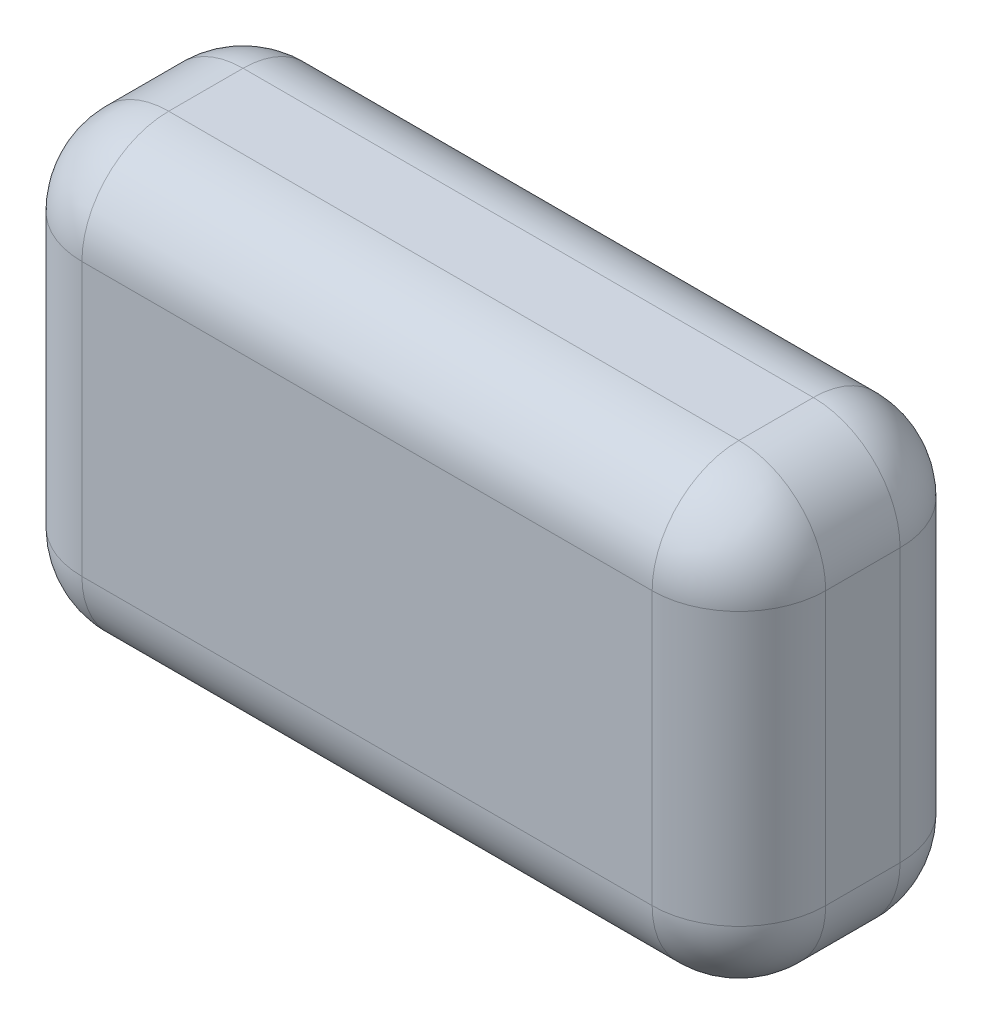
ISO-10303-21;
HEADER;
FILE_DESCRIPTION(('STEP AP214'),'2;1');
FILE_NAME('part.step','',(''),(''),'','','');
FILE_SCHEMA(('AUTOMOTIVE_DESIGN { 1 0 10303 214 1 1 1 1 }'));
ENDSEC;
DATA;
#1=APPLICATION_CONTEXT('core data for automotive mechanical design processes');
#2=APPLICATION_PROTOCOL_DEFINITION('international standard','automotive_design',2000,#1);
#3=PRODUCT_CONTEXT('',#1,'mechanical');
#4=PRODUCT('Part','Part','',(#3));
#5=PRODUCT_RELATED_PRODUCT_CATEGORY('part','',(#4));
#6=PRODUCT_DEFINITION_FORMATION('','',#4);
#7=PRODUCT_DEFINITION_CONTEXT('part definition',#1,'design');
#8=PRODUCT_DEFINITION('design','',#6,#7);
#9=PRODUCT_DEFINITION_SHAPE('','',#8);
#10=(LENGTH_UNIT() NAMED_UNIT(*) SI_UNIT(.MILLI.,.METRE.));
#11=(NAMED_UNIT(*) PLANE_ANGLE_UNIT() SI_UNIT($,.RADIAN.));
#12=(NAMED_UNIT(*) SI_UNIT($,.STERADIAN.) SOLID_ANGLE_UNIT());
#13=UNCERTAINTY_MEASURE_WITH_UNIT(LENGTH_MEASURE(1.E-05),#10,'distance_accuracy_value','');
#14=(GEOMETRIC_REPRESENTATION_CONTEXT(3) GLOBAL_UNCERTAINTY_ASSIGNED_CONTEXT((#13)) GLOBAL_UNIT_ASSIGNED_CONTEXT((#10,
#11,#12)) REPRESENTATION_CONTEXT('',''));
#15=CARTESIAN_POINT('',(0.,0.,0.));
#16=DIRECTION('',(0.,0.,1.));
#17=DIRECTION('',(1.,0.,0.));
#18=AXIS2_PLACEMENT_3D('',#15,#16,#17);
#19=CARTESIAN_POINT('',(381.,228.6,127.));
#20=DIRECTION('',(-1.,0.,0.));
#21=DIRECTION('',(0.,-1.,0.));
#22=AXIS2_PLACEMENT_3D('',#19,#20,#21);
#23=PLANE('',#22);
#24=DIRECTION('',(0.,0.,-1.));
#25=VECTOR('',#24,1.);
#26=CARTESIAN_POINT('',(381.,-139.7,127.));
#27=LINE('',#26,#25);
#28=CARTESIAN_POINT('',(381.,-139.7,38.1));
#29=VERTEX_POINT('',#28);
#30=CARTESIAN_POINT('',(381.,-139.7,-38.1));
#31=VERTEX_POINT('',#30);
#32=EDGE_CURVE('E256',#29,#31,#27,.T.);
#33=ORIENTED_EDGE('',*,*,#32,.T.);
#34=DIRECTION('',(0.,1.,0.));
#35=VECTOR('',#34,1.);
#36=CARTESIAN_POINT('',(381.,228.6,-38.1));
#37=LINE('',#36,#35);
#38=CARTESIAN_POINT('',(381.,139.7,-38.1));
#39=VERTEX_POINT('',#38);
#40=EDGE_CURVE('E251',#31,#39,#37,.T.);
#41=ORIENTED_EDGE('',*,*,#40,.T.);
#42=DIRECTION('',(0.,0.,-1.));
#43=VECTOR('',#42,1.);
#44=CARTESIAN_POINT('',(381.,139.7,127.));
#45=LINE('',#44,#43);
#46=CARTESIAN_POINT('',(381.,139.7,38.1));
#47=VERTEX_POINT('',#46);
#48=EDGE_CURVE('E337',#39,#47,#45,.F.);
#49=ORIENTED_EDGE('',*,*,#48,.T.);
#50=DIRECTION('',(0.,1.,0.));
#51=VECTOR('',#50,1.);
#52=CARTESIAN_POINT('',(381.,-228.6,38.1));
#53=LINE('',#52,#51);
#54=EDGE_CURVE('E246',#47,#29,#53,.F.);
#55=ORIENTED_EDGE('',*,*,#54,.T.);
#56=EDGE_LOOP('',(#33,#41,#49,#55));
#57=FACE_BOUND('',#56,.T.);
#58=ADVANCED_FACE('F45',(#57),#23,.F.);
#59=CARTESIAN_POINT('',(-381.,228.6,127.));
#60=DIRECTION('',(0.,-1.,0.));
#61=DIRECTION('',(0.,0.,-1.));
#62=AXIS2_PLACEMENT_3D('',#59,#60,#61);
#63=PLANE('',#62);
#64=DIRECTION('',(-1.,0.,0.));
#65=VECTOR('',#64,1.);
#66=CARTESIAN_POINT('',(-381.,228.6,-38.1));
#67=LINE('',#66,#65);
#68=CARTESIAN_POINT('',(292.1,228.6,-38.1));
#69=VERTEX_POINT('',#68);
#70=CARTESIAN_POINT('',(-292.1,228.6,-38.1));
#71=VERTEX_POINT('',#70);
#72=EDGE_CURVE('E300',#69,#71,#67,.T.);
#73=ORIENTED_EDGE('',*,*,#72,.T.);
#74=DIRECTION('',(0.,0.,-1.));
#75=VECTOR('',#74,1.);
#76=CARTESIAN_POINT('',(-292.1,228.6,127.));
#77=LINE('',#76,#75);
#78=CARTESIAN_POINT('',(-292.1,228.6,38.1));
#79=VERTEX_POINT('',#78);
#80=EDGE_CURVE('E297',#71,#79,#77,.F.);
#81=ORIENTED_EDGE('',*,*,#80,.T.);
#82=DIRECTION('',(-1.,0.,0.));
#83=VECTOR('',#82,1.);
#84=CARTESIAN_POINT('',(381.,228.6,38.1));
#85=LINE('',#84,#83);
#86=CARTESIAN_POINT('',(292.1,228.6,38.1));
#87=VERTEX_POINT('',#86);
#88=EDGE_CURVE('E288',#79,#87,#85,.F.);
#89=ORIENTED_EDGE('',*,*,#88,.T.);
#90=DIRECTION('',(0.,0.,-1.));
#91=VECTOR('',#90,1.);
#92=CARTESIAN_POINT('',(292.1,228.6,127.));
#93=LINE('',#92,#91);
#94=EDGE_CURVE('E294',#87,#69,#93,.T.);
#95=ORIENTED_EDGE('',*,*,#94,.T.);
#96=EDGE_LOOP('',(#73,#81,#89,#95));
#97=FACE_BOUND('',#96,.T.);
#98=ADVANCED_FACE('F298',(#97),#63,.F.);
#99=CARTESIAN_POINT('',(-381.,228.6,127.));
#100=DIRECTION('',(1.,0.,0.));
#101=DIRECTION('',(0.,1.,0.));
#102=AXIS2_PLACEMENT_3D('',#99,#100,#101);
#103=PLANE('',#102);
#104=DIRECTION('',(0.,-1.,0.));
#105=VECTOR('',#104,1.);
#106=CARTESIAN_POINT('',(-381.,228.6,38.1));
#107=LINE('',#106,#105);
#108=CARTESIAN_POINT('',(-381.,-139.7,38.1));
#109=VERTEX_POINT('',#108);
#110=CARTESIAN_POINT('',(-381.,139.7,38.1));
#111=VERTEX_POINT('',#110);
#112=EDGE_CURVE('E145',#109,#111,#107,.F.);
#113=ORIENTED_EDGE('',*,*,#112,.T.);
#114=DIRECTION('',(0.,0.,-1.));
#115=VECTOR('',#114,1.);
#116=CARTESIAN_POINT('',(-381.,139.7,127.));
#117=LINE('',#116,#115);
#118=CARTESIAN_POINT('',(-381.,139.7,-38.1));
#119=VERTEX_POINT('',#118);
#120=EDGE_CURVE('E140',#111,#119,#117,.T.);
#121=ORIENTED_EDGE('',*,*,#120,.T.);
#122=DIRECTION('',(0.,-1.,0.));
#123=VECTOR('',#122,1.);
#124=CARTESIAN_POINT('',(-381.,228.6,-38.1));
#125=LINE('',#124,#123);
#126=CARTESIAN_POINT('',(-381.,-139.7,-38.1));
#127=VERTEX_POINT('',#126);
#128=EDGE_CURVE('E134',#119,#127,#125,.T.);
#129=ORIENTED_EDGE('',*,*,#128,.T.);
#130=DIRECTION('',(0.,0.,-1.));
#131=VECTOR('',#130,1.);
#132=CARTESIAN_POINT('',(-381.,-139.7,127.));
#133=LINE('',#132,#131);
#134=EDGE_CURVE('E137',#127,#109,#133,.F.);
#135=ORIENTED_EDGE('',*,*,#134,.T.);
#136=EDGE_LOOP('',(#113,#121,#129,#135));
#137=FACE_BOUND('',#136,.T.);
#138=ADVANCED_FACE('F136',(#137),#103,.F.);
#139=CARTESIAN_POINT('',(-381.,-228.6,127.));
#140=DIRECTION('',(0.,1.,0.));
#141=DIRECTION('',(0.,0.,1.));
#142=AXIS2_PLACEMENT_3D('',#139,#140,#141);
#143=PLANE('',#142);
#144=DIRECTION('',(0.,0.,-1.));
#145=VECTOR('',#144,1.);
#146=CARTESIAN_POINT('',(-292.1,-228.6,127.));
#147=LINE('',#146,#145);
#148=CARTESIAN_POINT('',(-292.1,-228.6,38.1));
#149=VERTEX_POINT('',#148);
#150=CARTESIAN_POINT('',(-292.1,-228.6,-38.1));
#151=VERTEX_POINT('',#150);
#152=EDGE_CURVE('E322',#149,#151,#147,.T.);
#153=ORIENTED_EDGE('',*,*,#152,.T.);
#154=DIRECTION('',(1.,0.,0.));
#155=VECTOR('',#154,1.);
#156=CARTESIAN_POINT('',(-381.,-228.6,-38.1));
#157=LINE('',#156,#155);
#158=CARTESIAN_POINT('',(292.1,-228.6,-38.1));
#159=VERTEX_POINT('',#158);
#160=EDGE_CURVE('E331',#151,#159,#157,.T.);
#161=ORIENTED_EDGE('',*,*,#160,.T.);
#162=DIRECTION('',(0.,0.,-1.));
#163=VECTOR('',#162,1.);
#164=CARTESIAN_POINT('',(292.1,-228.6,127.));
#165=LINE('',#164,#163);
#166=CARTESIAN_POINT('',(292.1,-228.6,38.1));
#167=VERTEX_POINT('',#166);
#168=EDGE_CURVE('E328',#159,#167,#165,.F.);
#169=ORIENTED_EDGE('',*,*,#168,.T.);
#170=DIRECTION('',(1.,0.,0.));
#171=VECTOR('',#170,1.);
#172=CARTESIAN_POINT('',(-381.,-228.6,38.1));
#173=LINE('',#172,#171);
#174=EDGE_CURVE('E325',#167,#149,#173,.F.);
#175=ORIENTED_EDGE('',*,*,#174,.T.);
#176=EDGE_LOOP('',(#153,#161,#169,#175));
#177=FACE_BOUND('',#176,.T.);
#178=ADVANCED_FACE('F345',(#177),#143,.F.);
#179=CARTESIAN_POINT('',(0.,0.,127.));
#180=DIRECTION('',(0.,0.,1.));
#181=DIRECTION('',(1.,0.,0.));
#182=AXIS2_PLACEMENT_3D('',#179,#180,#181);
#183=PLANE('',#182);
#184=DIRECTION('',(0.,-1.,0.));
#185=VECTOR('',#184,1.);
#186=CARTESIAN_POINT('',(-292.1,-228.6,127.));
#187=LINE('',#186,#185);
#188=CARTESIAN_POINT('',(-292.1,139.7,127.));
#189=VERTEX_POINT('',#188);
#190=CARTESIAN_POINT('',(-292.1,-139.7,127.));
#191=VERTEX_POINT('',#190);
#192=EDGE_CURVE('E55',#189,#191,#187,.T.);
#193=ORIENTED_EDGE('',*,*,#192,.T.);
#194=DIRECTION('',(1.,0.,0.));
#195=VECTOR('',#194,1.);
#196=CARTESIAN_POINT('',(381.,-139.7,127.));
#197=LINE('',#196,#195);
#198=CARTESIAN_POINT('',(292.1,-139.7,127.));
#199=VERTEX_POINT('',#198);
#200=EDGE_CURVE('E11',#191,#199,#197,.T.);
#201=ORIENTED_EDGE('',*,*,#200,.T.);
#202=DIRECTION('',(0.,1.,0.));
#203=VECTOR('',#202,1.);
#204=CARTESIAN_POINT('',(292.1,228.6,127.));
#205=LINE('',#204,#203);
#206=CARTESIAN_POINT('',(292.1,139.7,127.));
#207=VERTEX_POINT('',#206);
#208=EDGE_CURVE('E248',#199,#207,#205,.T.);
#209=ORIENTED_EDGE('',*,*,#208,.T.);
#210=DIRECTION('',(-1.,0.,0.));
#211=VECTOR('',#210,1.);
#212=CARTESIAN_POINT('',(-381.,139.7,127.));
#213=LINE('',#212,#211);
#214=EDGE_CURVE('E66',#207,#189,#213,.T.);
#215=ORIENTED_EDGE('',*,*,#214,.T.);
#216=EDGE_LOOP('',(#193,#201,#209,#215));
#217=FACE_BOUND('',#216,.T.);
#218=ADVANCED_FACE('F535',(#217),#183,.T.);
#219=CARTESIAN_POINT('',(0.,0.,-127.));
#220=DIRECTION('',(0.,0.,1.));
#221=DIRECTION('',(1.,0.,0.));
#222=AXIS2_PLACEMENT_3D('',#219,#220,#221);
#223=PLANE('',#222);
#224=DIRECTION('',(0.,-1.,0.));
#225=VECTOR('',#224,1.);
#226=CARTESIAN_POINT('',(-292.1,0.,-127.));
#227=LINE('',#226,#225);
#228=CARTESIAN_POINT('',(-292.1,-139.7,-127.));
#229=VERTEX_POINT('',#228);
#230=CARTESIAN_POINT('',(-292.1,139.7,-127.));
#231=VERTEX_POINT('',#230);
#232=EDGE_CURVE('E169',#229,#231,#227,.F.);
#233=ORIENTED_EDGE('',*,*,#232,.T.);
#234=DIRECTION('',(-1.,0.,0.));
#235=VECTOR('',#234,1.);
#236=CARTESIAN_POINT('',(0.,139.7,-127.));
#237=LINE('',#236,#235);
#238=CARTESIAN_POINT('',(292.1,139.7,-127.));
#239=VERTEX_POINT('',#238);
#240=EDGE_CURVE('E318',#231,#239,#237,.F.);
#241=ORIENTED_EDGE('',*,*,#240,.T.);
#242=DIRECTION('',(0.,1.,0.));
#243=VECTOR('',#242,1.);
#244=CARTESIAN_POINT('',(292.1,0.,-127.));
#245=LINE('',#244,#243);
#246=CARTESIAN_POINT('',(292.1,-139.7,-127.));
#247=VERTEX_POINT('',#246);
#248=EDGE_CURVE('E305',#239,#247,#245,.F.);
#249=ORIENTED_EDGE('',*,*,#248,.T.);
#250=DIRECTION('',(1.,0.,0.));
#251=VECTOR('',#250,1.);
#252=CARTESIAN_POINT('',(0.,-139.7,-127.));
#253=LINE('',#252,#251);
#254=EDGE_CURVE('E309',#247,#229,#253,.F.);
#255=ORIENTED_EDGE('',*,*,#254,.T.);
#256=EDGE_LOOP('',(#233,#241,#249,#255));
#257=FACE_BOUND('',#256,.T.);
#258=ADVANCED_FACE('F528',(#257),#223,.F.);
#259=CARTESIAN_POINT('',(292.1,-139.7,127.));
#260=DIRECTION('',(0.,0.,-1.));
#261=DIRECTION('',(-1.,0.,0.));
#262=AXIS2_PLACEMENT_3D('',#259,#260,#261);
#263=CYLINDRICAL_SURFACE('',#262,88.9);
#264=CARTESIAN_POINT('',(292.1,-139.7,38.1));
#265=DIRECTION('',(0.,0.,1.));
#266=DIRECTION('',(1.,0.,0.));
#267=AXIS2_PLACEMENT_3D('',#264,#265,#266);
#268=CIRCLE('',#267,88.9);
#269=EDGE_CURVE('E49',#167,#29,#268,.T.);
#270=ORIENTED_EDGE('',*,*,#269,.F.);
#271=ORIENTED_EDGE('',*,*,#168,.F.);
#272=CARTESIAN_POINT('',(292.1,-139.7,-38.1));
#273=DIRECTION('',(0.,0.,-1.));
#274=DIRECTION('',(-1.,0.,0.));
#275=AXIS2_PLACEMENT_3D('',#272,#273,#274);
#276=CIRCLE('',#275,88.9);
#277=EDGE_CURVE('E224',#31,#159,#276,.T.);
#278=ORIENTED_EDGE('',*,*,#277,.F.);
#279=ORIENTED_EDGE('',*,*,#32,.F.);
#280=EDGE_LOOP('',(#270,#271,#278,#279));
#281=FACE_BOUND('',#280,.T.);
#282=ADVANCED_FACE('F47',(#281),#263,.T.);
#283=CARTESIAN_POINT('',(292.1,-139.7,38.1));
#284=DIRECTION('',(1.,0.,0.));
#285=DIRECTION('',(0.,1.,0.));
#286=AXIS2_PLACEMENT_3D('',#283,#284,#285);
#287=SPHERICAL_SURFACE('',#286,88.9);
#288=CARTESIAN_POINT('',(292.1,-139.7,38.1));
#289=DIRECTION('',(1.,0.,0.));
#290=DIRECTION('',(0.,0.,-1.));
#291=AXIS2_PLACEMENT_3D('',#288,#289,#290);
#292=CIRCLE('',#291,88.9);
#293=EDGE_CURVE('E217',#167,#199,#292,.F.);
#294=ORIENTED_EDGE('',*,*,#293,.F.);
#295=ORIENTED_EDGE('',*,*,#269,.T.);
#296=CARTESIAN_POINT('',(292.1,-139.7,38.1));
#297=DIRECTION('',(0.,-1.,0.));
#298=DIRECTION('',(1.,0.,0.));
#299=AXIS2_PLACEMENT_3D('',#296,#297,#298);
#300=CIRCLE('',#299,88.9);
#301=EDGE_CURVE('E221',#199,#29,#300,.F.);
#302=ORIENTED_EDGE('',*,*,#301,.F.);
#303=EDGE_LOOP('',(#294,#295,#302));
#304=FACE_BOUND('',#303,.T.);
#305=ADVANCED_FACE('F238',(#304),#287,.T.);
#306=CARTESIAN_POINT('',(292.1,-139.7,-38.1));
#307=DIRECTION('',(0.,-1.,0.));
#308=DIRECTION('',(0.,0.,-1.));
#309=AXIS2_PLACEMENT_3D('',#306,#307,#308);
#310=SPHERICAL_SURFACE('',#309,88.9);
#311=CARTESIAN_POINT('',(292.1,-139.7,-38.1));
#312=DIRECTION('',(0.,-1.,0.));
#313=DIRECTION('',(1.,0.,0.));
#314=AXIS2_PLACEMENT_3D('',#311,#312,#313);
#315=CIRCLE('',#314,88.9);
#316=EDGE_CURVE('E210',#31,#247,#315,.F.);
#317=ORIENTED_EDGE('',*,*,#316,.F.);
#318=ORIENTED_EDGE('',*,*,#277,.T.);
#319=CARTESIAN_POINT('',(292.1,-139.7,-38.1));
#320=DIRECTION('',(1.,0.,0.));
#321=DIRECTION('',(0.,0.,-1.));
#322=AXIS2_PLACEMENT_3D('',#319,#320,#321);
#323=CIRCLE('',#322,88.9);
#324=EDGE_CURVE('E214',#247,#159,#323,.F.);
#325=ORIENTED_EDGE('',*,*,#324,.F.);
#326=EDGE_LOOP('',(#317,#318,#325));
#327=FACE_BOUND('',#326,.T.);
#328=ADVANCED_FACE('F349',(#327),#310,.T.);
#329=CARTESIAN_POINT('',(292.1,0.,38.1));
#330=DIRECTION('',(0.,-1.,0.));
#331=DIRECTION('',(1.,0.,0.));
#332=AXIS2_PLACEMENT_3D('',#329,#330,#331);
#333=CYLINDRICAL_SURFACE('',#332,88.9);
#334=ORIENTED_EDGE('',*,*,#301,.T.);
#335=ORIENTED_EDGE('',*,*,#54,.F.);
#336=CARTESIAN_POINT('',(292.1,139.7,38.1));
#337=DIRECTION('',(0.,1.,0.));
#338=DIRECTION('',(-1.,0.,0.));
#339=AXIS2_PLACEMENT_3D('',#336,#337,#338);
#340=CIRCLE('',#339,88.9);
#341=EDGE_CURVE('E202',#207,#47,#340,.T.);
#342=ORIENTED_EDGE('',*,*,#341,.F.);
#343=ORIENTED_EDGE('',*,*,#208,.F.);
#344=EDGE_LOOP('',(#334,#335,#342,#343));
#345=FACE_BOUND('',#344,.T.);
#346=ADVANCED_FACE('F244',(#345),#333,.T.);
#347=CARTESIAN_POINT('',(0.,-139.7,38.1));
#348=DIRECTION('',(-1.,0.,0.));
#349=DIRECTION('',(0.,0.,1.));
#350=AXIS2_PLACEMENT_3D('',#347,#348,#349);
#351=CYLINDRICAL_SURFACE('',#350,88.9);
#352=ORIENTED_EDGE('',*,*,#293,.T.);
#353=ORIENTED_EDGE('',*,*,#200,.F.);
#354=CARTESIAN_POINT('',(-292.1,-139.7,38.1));
#355=DIRECTION('',(-1.,0.,0.));
#356=DIRECTION('',(0.,0.,1.));
#357=AXIS2_PLACEMENT_3D('',#354,#355,#356);
#358=CIRCLE('',#357,88.9);
#359=EDGE_CURVE('E198',#149,#191,#358,.T.);
#360=ORIENTED_EDGE('',*,*,#359,.F.);
#361=ORIENTED_EDGE('',*,*,#174,.F.);
#362=EDGE_LOOP('',(#352,#353,#360,#361));
#363=FACE_BOUND('',#362,.T.);
#364=ADVANCED_FACE('F492',(#363),#351,.T.);
#365=CARTESIAN_POINT('',(-292.1,-139.7,127.));
#366=DIRECTION('',(0.,0.,-1.));
#367=DIRECTION('',(-1.,0.,0.));
#368=AXIS2_PLACEMENT_3D('',#365,#366,#367);
#369=CYLINDRICAL_SURFACE('',#368,88.9);
#370=CARTESIAN_POINT('',(-292.1,-139.7,-38.1));
#371=DIRECTION('',(0.,0.,-1.));
#372=DIRECTION('',(-1.,0.,0.));
#373=AXIS2_PLACEMENT_3D('',#370,#371,#372);
#374=CIRCLE('',#373,88.9);
#375=EDGE_CURVE('E152',#151,#127,#374,.T.);
#376=ORIENTED_EDGE('',*,*,#375,.F.);
#377=ORIENTED_EDGE('',*,*,#152,.F.);
#378=CARTESIAN_POINT('',(-292.1,-139.7,38.1));
#379=DIRECTION('',(0.,0.,1.));
#380=DIRECTION('',(1.,0.,0.));
#381=AXIS2_PLACEMENT_3D('',#378,#379,#380);
#382=CIRCLE('',#381,88.9);
#383=EDGE_CURVE('E155',#109,#149,#382,.T.);
#384=ORIENTED_EDGE('',*,*,#383,.F.);
#385=ORIENTED_EDGE('',*,*,#134,.F.);
#386=EDGE_LOOP('',(#376,#377,#384,#385));
#387=FACE_BOUND('',#386,.T.);
#388=ADVANCED_FACE('F150',(#387),#369,.T.);
#389=CARTESIAN_POINT('',(-381.,-139.7,-38.1));
#390=DIRECTION('',(1.,0.,0.));
#391=DIRECTION('',(0.,0.,-1.));
#392=AXIS2_PLACEMENT_3D('',#389,#390,#391);
#393=CYLINDRICAL_SURFACE('',#392,88.9);
#394=ORIENTED_EDGE('',*,*,#324,.T.);
#395=ORIENTED_EDGE('',*,*,#160,.F.);
#396=CARTESIAN_POINT('',(-292.1,-139.7,-38.1));
#397=DIRECTION('',(-1.,0.,0.));
#398=DIRECTION('',(0.,-1.,0.));
#399=AXIS2_PLACEMENT_3D('',#396,#397,#398);
#400=CIRCLE('',#399,88.9);
#401=EDGE_CURVE('E165',#229,#151,#400,.T.);
#402=ORIENTED_EDGE('',*,*,#401,.F.);
#403=ORIENTED_EDGE('',*,*,#254,.F.);
#404=EDGE_LOOP('',(#394,#395,#402,#403));
#405=FACE_BOUND('',#404,.T.);
#406=ADVANCED_FACE('F347',(#405),#393,.T.);
#407=CARTESIAN_POINT('',(292.1,228.6,-38.1));
#408=DIRECTION('',(0.,1.,0.));
#409=DIRECTION('',(-1.,0.,0.));
#410=AXIS2_PLACEMENT_3D('',#407,#408,#409);
#411=CYLINDRICAL_SURFACE('',#410,88.9);
#412=ORIENTED_EDGE('',*,*,#316,.T.);
#413=ORIENTED_EDGE('',*,*,#248,.F.);
#414=CARTESIAN_POINT('',(292.1,139.7,-38.1));
#415=DIRECTION('',(0.,1.,0.));
#416=DIRECTION('',(-1.,0.,0.));
#417=AXIS2_PLACEMENT_3D('',#414,#415,#416);
#418=CIRCLE('',#417,88.9);
#419=EDGE_CURVE('E190',#39,#239,#418,.T.);
#420=ORIENTED_EDGE('',*,*,#419,.F.);
#421=ORIENTED_EDGE('',*,*,#40,.F.);
#422=EDGE_LOOP('',(#412,#413,#420,#421));
#423=FACE_BOUND('',#422,.T.);
#424=ADVANCED_FACE('F352',(#423),#411,.T.);
#425=CARTESIAN_POINT('',(292.1,139.7,127.));
#426=DIRECTION('',(0.,0.,-1.));
#427=DIRECTION('',(-1.,0.,0.));
#428=AXIS2_PLACEMENT_3D('',#425,#426,#427);
#429=CYLINDRICAL_SURFACE('',#428,88.9);
#430=CARTESIAN_POINT('',(292.1,139.7,38.1));
#431=DIRECTION('',(0.,0.,1.));
#432=DIRECTION('',(1.,0.,0.));
#433=AXIS2_PLACEMENT_3D('',#430,#431,#432);
#434=CIRCLE('',#433,88.9);
#435=EDGE_CURVE('E206',#47,#87,#434,.T.);
#436=ORIENTED_EDGE('',*,*,#435,.F.);
#437=ORIENTED_EDGE('',*,*,#48,.F.);
#438=CARTESIAN_POINT('',(292.1,139.7,-38.1));
#439=DIRECTION('',(0.,0.,-1.));
#440=DIRECTION('',(-1.,0.,0.));
#441=AXIS2_PLACEMENT_3D('',#438,#439,#440);
#442=CIRCLE('',#441,88.9);
#443=EDGE_CURVE('E186',#69,#39,#442,.T.);
#444=ORIENTED_EDGE('',*,*,#443,.F.);
#445=ORIENTED_EDGE('',*,*,#94,.F.);
#446=EDGE_LOOP('',(#436,#437,#444,#445));
#447=FACE_BOUND('',#446,.T.);
#448=ADVANCED_FACE('F359',(#447),#429,.T.);
#449=CARTESIAN_POINT('',(292.1,139.7,38.1));
#450=DIRECTION('',(1.,0.,0.));
#451=DIRECTION('',(0.,1.,0.));
#452=AXIS2_PLACEMENT_3D('',#449,#450,#451);
#453=SPHERICAL_SURFACE('',#452,88.9);
#454=ORIENTED_EDGE('',*,*,#341,.T.);
#455=ORIENTED_EDGE('',*,*,#435,.T.);
#456=CARTESIAN_POINT('',(292.1,139.7,38.1));
#457=DIRECTION('',(1.,0.,0.));
#458=DIRECTION('',(0.,0.,-1.));
#459=AXIS2_PLACEMENT_3D('',#456,#457,#458);
#460=CIRCLE('',#459,88.9);
#461=EDGE_CURVE('E177',#207,#87,#460,.F.);
#462=ORIENTED_EDGE('',*,*,#461,.F.);
#463=EDGE_LOOP('',(#454,#455,#462));
#464=FACE_BOUND('',#463,.T.);
#465=ADVANCED_FACE('F361',(#464),#453,.T.);
#466=CARTESIAN_POINT('',(-292.1,-139.7,38.1));
#467=DIRECTION('',(0.,-1.,0.));
#468=DIRECTION('',(1.,0.,0.));
#469=AXIS2_PLACEMENT_3D('',#466,#467,#468);
#470=SPHERICAL_SURFACE('',#469,88.9);
#471=ORIENTED_EDGE('',*,*,#383,.T.);
#472=ORIENTED_EDGE('',*,*,#359,.T.);
#473=CARTESIAN_POINT('',(-292.1,-139.7,38.1));
#474=DIRECTION('',(0.,-1.,0.));
#475=DIRECTION('',(1.,0.,0.));
#476=AXIS2_PLACEMENT_3D('',#473,#474,#475);
#477=CIRCLE('',#476,88.9);
#478=EDGE_CURVE('E171',#109,#191,#477,.F.);
#479=ORIENTED_EDGE('',*,*,#478,.F.);
#480=EDGE_LOOP('',(#471,#472,#479));
#481=FACE_BOUND('',#480,.T.);
#482=ADVANCED_FACE('F363',(#481),#470,.T.);
#483=CARTESIAN_POINT('',(-292.1,-139.7,-38.1));
#484=DIRECTION('',(0.,-1.,0.));
#485=DIRECTION('',(1.,0.,0.));
#486=AXIS2_PLACEMENT_3D('',#483,#484,#485);
#487=SPHERICAL_SURFACE('',#486,88.9);
#488=ORIENTED_EDGE('',*,*,#401,.T.);
#489=ORIENTED_EDGE('',*,*,#375,.T.);
#490=CARTESIAN_POINT('',(-292.1,-139.7,-38.1));
#491=DIRECTION('',(0.,-1.,0.));
#492=DIRECTION('',(1.,0.,0.));
#493=AXIS2_PLACEMENT_3D('',#490,#491,#492);
#494=CIRCLE('',#493,88.9);
#495=EDGE_CURVE('E162',#229,#127,#494,.F.);
#496=ORIENTED_EDGE('',*,*,#495,.F.);
#497=EDGE_LOOP('',(#488,#489,#496));
#498=FACE_BOUND('',#497,.T.);
#499=ADVANCED_FACE('F161',(#498),#487,.T.);
#500=CARTESIAN_POINT('',(292.1,139.7,-38.1));
#501=DIRECTION('',(1.,0.,0.));
#502=DIRECTION('',(0.,1.,0.));
#503=AXIS2_PLACEMENT_3D('',#500,#501,#502);
#504=SPHERICAL_SURFACE('',#503,88.9);
#505=ORIENTED_EDGE('',*,*,#443,.T.);
#506=ORIENTED_EDGE('',*,*,#419,.T.);
#507=CARTESIAN_POINT('',(292.1,139.7,-38.1));
#508=DIRECTION('',(1.,0.,0.));
#509=DIRECTION('',(0.,0.,-1.));
#510=AXIS2_PLACEMENT_3D('',#507,#508,#509);
#511=CIRCLE('',#510,88.9);
#512=EDGE_CURVE('E172',#69,#239,#511,.F.);
#513=ORIENTED_EDGE('',*,*,#512,.F.);
#514=EDGE_LOOP('',(#505,#506,#513));
#515=FACE_BOUND('',#514,.T.);
#516=ADVANCED_FACE('F357',(#515),#504,.T.);
#517=CARTESIAN_POINT('',(0.,139.7,38.1));
#518=DIRECTION('',(1.,0.,0.));
#519=DIRECTION('',(0.,0.,-1.));
#520=AXIS2_PLACEMENT_3D('',#517,#518,#519);
#521=CYLINDRICAL_SURFACE('',#520,88.9);
#522=ORIENTED_EDGE('',*,*,#461,.T.);
#523=ORIENTED_EDGE('',*,*,#88,.F.);
#524=CARTESIAN_POINT('',(-292.1,139.7,38.1));
#525=DIRECTION('',(-1.,0.,0.));
#526=DIRECTION('',(0.,0.,1.));
#527=AXIS2_PLACEMENT_3D('',#524,#525,#526);
#528=CIRCLE('',#527,88.9);
#529=EDGE_CURVE('E179',#189,#79,#528,.T.);
#530=ORIENTED_EDGE('',*,*,#529,.F.);
#531=ORIENTED_EDGE('',*,*,#214,.F.);
#532=EDGE_LOOP('',(#522,#523,#530,#531));
#533=FACE_BOUND('',#532,.T.);
#534=ADVANCED_FACE('F290',(#533),#521,.T.);
#535=CARTESIAN_POINT('',(-292.1,0.,38.1));
#536=DIRECTION('',(0.,1.,0.));
#537=DIRECTION('',(-1.,0.,0.));
#538=AXIS2_PLACEMENT_3D('',#535,#536,#537);
#539=CYLINDRICAL_SURFACE('',#538,88.9);
#540=ORIENTED_EDGE('',*,*,#478,.T.);
#541=ORIENTED_EDGE('',*,*,#192,.F.);
#542=CARTESIAN_POINT('',(-292.1,139.7,38.1));
#543=DIRECTION('',(0.,1.,0.));
#544=DIRECTION('',(-1.,0.,0.));
#545=AXIS2_PLACEMENT_3D('',#542,#543,#544);
#546=CIRCLE('',#545,88.9);
#547=EDGE_CURVE('E276',#111,#189,#546,.T.);
#548=ORIENTED_EDGE('',*,*,#547,.F.);
#549=ORIENTED_EDGE('',*,*,#112,.F.);
#550=EDGE_LOOP('',(#540,#541,#548,#549));
#551=FACE_BOUND('',#550,.T.);
#552=ADVANCED_FACE('F395',(#551),#539,.T.);
#553=CARTESIAN_POINT('',(-292.1,228.6,-38.1));
#554=DIRECTION('',(0.,-1.,0.));
#555=DIRECTION('',(1.,0.,0.));
#556=AXIS2_PLACEMENT_3D('',#553,#554,#555);
#557=CYLINDRICAL_SURFACE('',#556,88.9);
#558=ORIENTED_EDGE('',*,*,#495,.T.);
#559=ORIENTED_EDGE('',*,*,#128,.F.);
#560=CARTESIAN_POINT('',(-292.1,139.7,-38.1));
#561=DIRECTION('',(0.,1.,0.));
#562=DIRECTION('',(-1.,0.,0.));
#563=AXIS2_PLACEMENT_3D('',#560,#561,#562);
#564=CIRCLE('',#563,88.9);
#565=EDGE_CURVE('E272',#231,#119,#564,.T.);
#566=ORIENTED_EDGE('',*,*,#565,.F.);
#567=ORIENTED_EDGE('',*,*,#232,.F.);
#568=EDGE_LOOP('',(#558,#559,#566,#567));
#569=FACE_BOUND('',#568,.T.);
#570=ADVANCED_FACE('F168',(#569),#557,.T.);
#571=CARTESIAN_POINT('',(-381.,139.7,-38.1));
#572=DIRECTION('',(-1.,0.,0.));
#573=DIRECTION('',(0.,0.,1.));
#574=AXIS2_PLACEMENT_3D('',#571,#572,#573);
#575=CYLINDRICAL_SURFACE('',#574,88.9);
#576=ORIENTED_EDGE('',*,*,#512,.T.);
#577=ORIENTED_EDGE('',*,*,#240,.F.);
#578=CARTESIAN_POINT('',(-292.1,139.7,-38.1));
#579=DIRECTION('',(-1.,0.,0.));
#580=DIRECTION('',(0.,0.,1.));
#581=AXIS2_PLACEMENT_3D('',#578,#579,#580);
#582=CIRCLE('',#581,88.9);
#583=EDGE_CURVE('E268',#71,#231,#582,.T.);
#584=ORIENTED_EDGE('',*,*,#583,.F.);
#585=ORIENTED_EDGE('',*,*,#72,.F.);
#586=EDGE_LOOP('',(#576,#577,#584,#585));
#587=FACE_BOUND('',#586,.T.);
#588=ADVANCED_FACE('F389',(#587),#575,.T.);
#589=CARTESIAN_POINT('',(-292.1,139.7,38.1));
#590=DIRECTION('',(0.,0.,1.));
#591=DIRECTION('',(1.,0.,0.));
#592=AXIS2_PLACEMENT_3D('',#589,#590,#591);
#593=SPHERICAL_SURFACE('',#592,88.9);
#594=ORIENTED_EDGE('',*,*,#547,.T.);
#595=ORIENTED_EDGE('',*,*,#529,.T.);
#596=CARTESIAN_POINT('',(-292.1,139.7,38.1));
#597=DIRECTION('',(0.,0.,1.));
#598=DIRECTION('',(1.,0.,0.));
#599=AXIS2_PLACEMENT_3D('',#596,#597,#598);
#600=CIRCLE('',#599,88.9);
#601=EDGE_CURVE('E265',#111,#79,#600,.F.);
#602=ORIENTED_EDGE('',*,*,#601,.F.);
#603=EDGE_LOOP('',(#594,#595,#602));
#604=FACE_BOUND('',#603,.T.);
#605=ADVANCED_FACE('F285',(#604),#593,.T.);
#606=CARTESIAN_POINT('',(-292.1,139.7,-38.1));
#607=DIRECTION('',(0.,0.,-1.));
#608=DIRECTION('',(-1.,0.,0.));
#609=AXIS2_PLACEMENT_3D('',#606,#607,#608);
#610=SPHERICAL_SURFACE('',#609,88.9);
#611=ORIENTED_EDGE('',*,*,#583,.T.);
#612=ORIENTED_EDGE('',*,*,#565,.T.);
#613=CARTESIAN_POINT('',(-292.1,139.7,-38.1));
#614=DIRECTION('',(0.,0.,-1.));
#615=DIRECTION('',(-1.,0.,0.));
#616=AXIS2_PLACEMENT_3D('',#613,#614,#615);
#617=CIRCLE('',#616,88.9);
#618=EDGE_CURVE('E262',#71,#119,#617,.F.);
#619=ORIENTED_EDGE('',*,*,#618,.F.);
#620=EDGE_LOOP('',(#611,#612,#619));
#621=FACE_BOUND('',#620,.T.);
#622=ADVANCED_FACE('F383',(#621),#610,.T.);
#623=CARTESIAN_POINT('',(-292.1,139.7,127.));
#624=DIRECTION('',(0.,0.,-1.));
#625=DIRECTION('',(-1.,0.,0.));
#626=AXIS2_PLACEMENT_3D('',#623,#624,#625);
#627=CYLINDRICAL_SURFACE('',#626,88.9);
#628=ORIENTED_EDGE('',*,*,#601,.T.);
#629=ORIENTED_EDGE('',*,*,#80,.F.);
#630=ORIENTED_EDGE('',*,*,#618,.T.);
#631=ORIENTED_EDGE('',*,*,#120,.F.);
#632=EDGE_LOOP('',(#628,#629,#630,#631));
#633=FACE_BOUND('',#632,.T.);
#634=ADVANCED_FACE('F380',(#633),#627,.T.);
#635=CLOSED_SHELL('',(#58,#98,#138,#178,#218,#258,#282,#305,#328,#346,#364,#388,#406,#424,#448,
#465,#482,#499,#516,#534,#552,#570,#588,#605,#622,#634));
#636=MANIFOLD_SOLID_BREP('B2',#635);
#637=ADVANCED_BREP_SHAPE_REPRESENTATION('',(#18,#636),#14);
#638=SHAPE_DEFINITION_REPRESENTATION(#9,#637);
ENDSEC;
END-ISO-10303-21;
